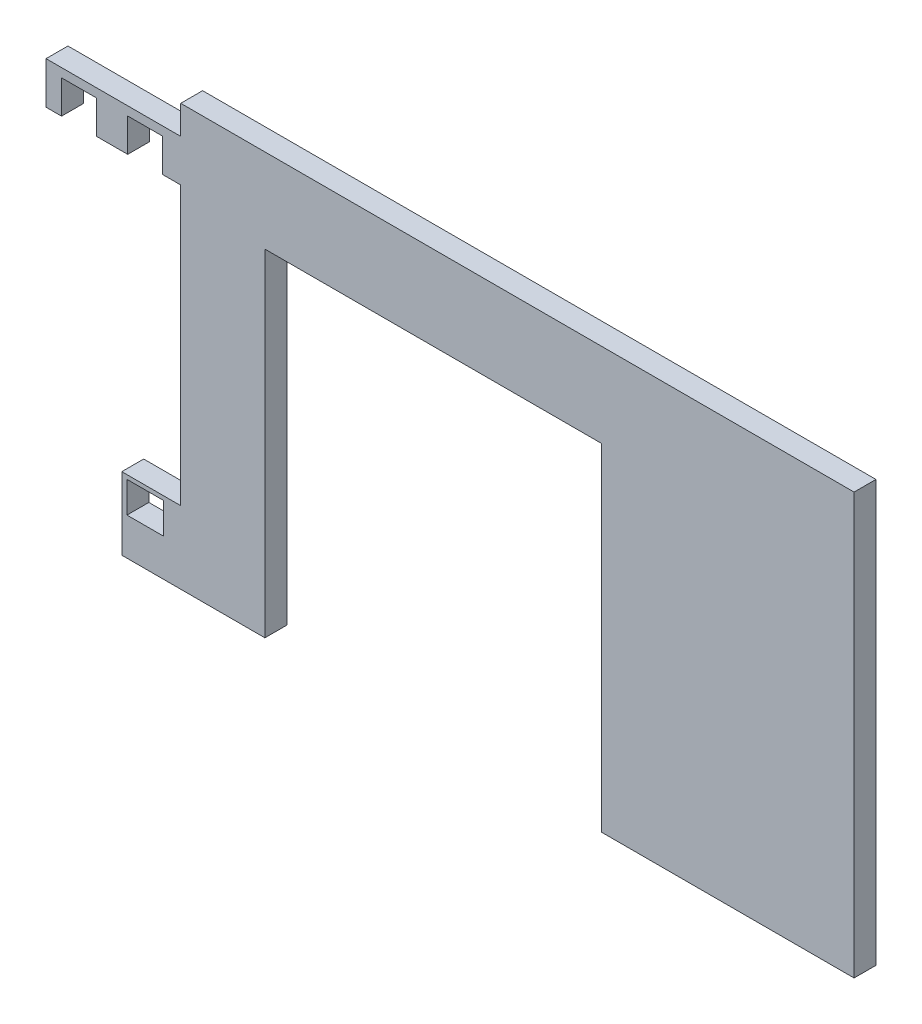
ISO-10303-21;
HEADER;
FILE_DESCRIPTION(('STEP AP214'),'2;1');
FILE_NAME('part.step','',(''),(''),'','','');
FILE_SCHEMA(('AUTOMOTIVE_DESIGN { 1 0 10303 214 1 1 1 1 }'));
ENDSEC;
DATA;
#1=APPLICATION_CONTEXT('core data for automotive mechanical design processes');
#2=APPLICATION_PROTOCOL_DEFINITION('international standard','automotive_design',2000,#1);
#3=PRODUCT_CONTEXT('',#1,'mechanical');
#4=PRODUCT('Part','Part','',(#3));
#5=PRODUCT_RELATED_PRODUCT_CATEGORY('part','',(#4));
#6=PRODUCT_DEFINITION_FORMATION('','',#4);
#7=PRODUCT_DEFINITION_CONTEXT('part definition',#1,'design');
#8=PRODUCT_DEFINITION('design','',#6,#7);
#9=PRODUCT_DEFINITION_SHAPE('','',#8);
#10=(LENGTH_UNIT() NAMED_UNIT(*) SI_UNIT(.MILLI.,.METRE.));
#11=(NAMED_UNIT(*) PLANE_ANGLE_UNIT() SI_UNIT($,.RADIAN.));
#12=(NAMED_UNIT(*) SI_UNIT($,.STERADIAN.) SOLID_ANGLE_UNIT());
#13=UNCERTAINTY_MEASURE_WITH_UNIT(LENGTH_MEASURE(1.E-05),#10,'distance_accuracy_value','');
#14=(GEOMETRIC_REPRESENTATION_CONTEXT(3) GLOBAL_UNCERTAINTY_ASSIGNED_CONTEXT((#13)) GLOBAL_UNIT_ASSIGNED_CONTEXT((#10,
#11,#12)) REPRESENTATION_CONTEXT('',''));
#15=CARTESIAN_POINT('',(0.,0.,0.));
#16=DIRECTION('',(0.,0.,1.));
#17=DIRECTION('',(1.,0.,0.));
#18=AXIS2_PLACEMENT_3D('',#15,#16,#17);
#19=CARTESIAN_POINT('',(-50.8,21.076628061647,21.2890793600851));
#20=DIRECTION('',(0.,-1.,0.));
#21=DIRECTION('',(0.,0.,1.));
#22=AXIS2_PLACEMENT_3D('',#19,#20,#21);
#23=PLANE('',#22);
#24=DIRECTION('',(0.,0.,-1.));
#25=VECTOR('',#24,1.);
#26=CARTESIAN_POINT('',(-68.7837095780898,21.076628061647,0.00100000000000013));
#27=LINE('',#26,#25);
#28=CARTESIAN_POINT('',(-68.7837095780898,21.076628061647,0.));
#29=VERTEX_POINT('',#28);
#30=CARTESIAN_POINT('',(-68.7837095780898,21.076628061647,-3.302));
#31=VERTEX_POINT('',#30);
#32=EDGE_CURVE('E215',#29,#31,#27,.T.);
#33=ORIENTED_EDGE('',*,*,#32,.F.);
#34=DIRECTION('',(-1.,0.,0.));
#35=VECTOR('',#34,1.);
#36=CARTESIAN_POINT('',(-50.8,21.076628061647,0.));
#37=LINE('',#36,#35);
#38=CARTESIAN_POINT('',(-71.12,21.076628061647,0.));
#39=VERTEX_POINT('',#38);
#40=EDGE_CURVE('E224',#29,#39,#37,.T.);
#41=ORIENTED_EDGE('',*,*,#40,.T.);
#42=DIRECTION('',(0.,0.,-1.));
#43=VECTOR('',#42,1.);
#44=CARTESIAN_POINT('',(-71.12,21.076628061647,21.2890793600851));
#45=LINE('',#44,#43);
#46=CARTESIAN_POINT('',(-71.12,21.076628061647,-3.302));
#47=VERTEX_POINT('',#46);
#48=EDGE_CURVE('E345',#39,#47,#45,.T.);
#49=ORIENTED_EDGE('',*,*,#48,.T.);
#50=DIRECTION('',(1.,0.,0.));
#51=VECTOR('',#50,1.);
#52=CARTESIAN_POINT('',(-50.8,21.076628061647,-3.302));
#53=LINE('',#52,#51);
#54=EDGE_CURVE('E237',#47,#31,#53,.T.);
#55=ORIENTED_EDGE('',*,*,#54,.T.);
#56=EDGE_LOOP('',(#33,#41,#49,#55));
#57=FACE_BOUND('',#56,.T.);
#58=ADVANCED_FACE('F35',(#57),#23,.T.);
#59=DIRECTION('',(0.,0.,1.));
#60=VECTOR('',#59,1.);
#61=CARTESIAN_POINT('',(-53.5162904219102,21.076628061647,0.00100000000000013));
#62=LINE('',#61,#60);
#63=CARTESIAN_POINT('',(-53.5162904219102,21.076628061647,-3.302));
#64=VERTEX_POINT('',#63);
#65=CARTESIAN_POINT('',(-53.5162904219102,21.076628061647,0.));
#66=VERTEX_POINT('',#65);
#67=EDGE_CURVE('E260',#64,#66,#62,.T.);
#68=ORIENTED_EDGE('',*,*,#67,.F.);
#69=CARTESIAN_POINT('',(-50.8,21.076628061647,-3.302));
#70=VERTEX_POINT('',#69);
#71=EDGE_CURVE('E339',#64,#70,#53,.T.);
#72=ORIENTED_EDGE('',*,*,#71,.T.);
#73=DIRECTION('',(0.,0.,-1.));
#74=VECTOR('',#73,1.);
#75=CARTESIAN_POINT('',(-50.8,21.076628061647,21.2890793600851));
#76=LINE('',#75,#74);
#77=CARTESIAN_POINT('',(-50.8,21.076628061647,0.));
#78=VERTEX_POINT('',#77);
#79=EDGE_CURVE('E331',#78,#70,#76,.T.);
#80=ORIENTED_EDGE('',*,*,#79,.F.);
#81=EDGE_CURVE('E234',#78,#66,#37,.T.);
#82=ORIENTED_EDGE('',*,*,#81,.T.);
#83=EDGE_LOOP('',(#68,#72,#80,#82));
#84=FACE_BOUND('',#83,.T.);
#85=ADVANCED_FACE('F463',(#84),#23,.T.);
#86=CARTESIAN_POINT('',(-50.8,-31.75,-3.302));
#87=DIRECTION('',(1.,0.,0.));
#88=DIRECTION('',(0.,0.,1.));
#89=AXIS2_PLACEMENT_3D('',#86,#87,#88);
#90=PLANE('',#89);
#91=DIRECTION('',(0.,-1.,0.));
#92=VECTOR('',#91,1.);
#93=CARTESIAN_POINT('',(-50.8,-31.75,0.));
#94=LINE('',#93,#92);
#95=CARTESIAN_POINT('',(-50.8,-20.828,0.));
#96=VERTEX_POINT('',#95);
#97=EDGE_CURVE('E371',#78,#96,#94,.T.);
#98=ORIENTED_EDGE('',*,*,#97,.F.);
#99=ORIENTED_EDGE('',*,*,#79,.T.);
#100=DIRECTION('',(0.,-1.,0.));
#101=VECTOR('',#100,1.);
#102=CARTESIAN_POINT('',(-50.8,-31.75,-3.302));
#103=LINE('',#102,#101);
#104=CARTESIAN_POINT('',(-50.8,-20.828,-3.302));
#105=VERTEX_POINT('',#104);
#106=EDGE_CURVE('E383',#70,#105,#103,.T.);
#107=ORIENTED_EDGE('',*,*,#106,.T.);
#108=DIRECTION('',(0.,0.,-1.));
#109=VECTOR('',#108,1.);
#110=CARTESIAN_POINT('',(-50.8,-20.828,21.2890793600851));
#111=LINE('',#110,#109);
#112=EDGE_CURVE('E322',#96,#105,#111,.T.);
#113=ORIENTED_EDGE('',*,*,#112,.F.);
#114=EDGE_LOOP('',(#98,#99,#107,#113));
#115=FACE_BOUND('',#114,.T.);
#116=ADVANCED_FACE('F469',(#115),#90,.F.);
#117=CARTESIAN_POINT('',(50.8,-31.75,-3.302));
#118=DIRECTION('',(0.,1.,0.));
#119=DIRECTION('',(0.,0.,-1.));
#120=AXIS2_PLACEMENT_3D('',#117,#118,#119);
#121=PLANE('',#120);
#122=DIRECTION('',(1.,0.,0.));
#123=VECTOR('',#122,1.);
#124=CARTESIAN_POINT('',(50.8,-31.75,0.));
#125=LINE('',#124,#123);
#126=CARTESIAN_POINT('',(-59.69,-31.75,0.));
#127=VERTEX_POINT('',#126);
#128=CARTESIAN_POINT('',(-38.1,-31.75,0.));
#129=VERTEX_POINT('',#128);
#130=EDGE_CURVE('E397',#127,#129,#125,.T.);
#131=ORIENTED_EDGE('',*,*,#130,.F.);
#132=DIRECTION('',(0.,0.,-1.));
#133=VECTOR('',#132,1.);
#134=CARTESIAN_POINT('',(-59.69,-31.75,21.2890793600851));
#135=LINE('',#134,#133);
#136=CARTESIAN_POINT('',(-59.69,-31.75,-3.302));
#137=VERTEX_POINT('',#136);
#138=EDGE_CURVE('E317',#127,#137,#135,.T.);
#139=ORIENTED_EDGE('',*,*,#138,.T.);
#140=DIRECTION('',(1.,0.,0.));
#141=VECTOR('',#140,1.);
#142=CARTESIAN_POINT('',(50.8,-31.75,-3.302));
#143=LINE('',#142,#141);
#144=CARTESIAN_POINT('',(-38.1,-31.75,-3.302));
#145=VERTEX_POINT('',#144);
#146=EDGE_CURVE('E384',#137,#145,#143,.T.);
#147=ORIENTED_EDGE('',*,*,#146,.T.);
#148=DIRECTION('',(0.,0.,-1.));
#149=VECTOR('',#148,1.);
#150=CARTESIAN_POINT('',(-38.1,-31.75,0.00100000000000013));
#151=LINE('',#150,#149);
#152=EDGE_CURVE('E368',#129,#145,#151,.T.);
#153=ORIENTED_EDGE('',*,*,#152,.F.);
#154=EDGE_LOOP('',(#131,#139,#147,#153));
#155=FACE_BOUND('',#154,.T.);
#156=ADVANCED_FACE('F480',(#155),#121,.F.);
#157=CARTESIAN_POINT('',(-50.8,31.75,0.));
#158=VERTEX_POINT('',#157);
#159=CARTESIAN_POINT('',(-50.8,27.426628061647,0.));
#160=VERTEX_POINT('',#159);
#161=EDGE_CURVE('E393',#158,#160,#94,.T.);
#162=ORIENTED_EDGE('',*,*,#161,.F.);
#163=DIRECTION('',(0.,0.,1.));
#164=VECTOR('',#163,1.);
#165=CARTESIAN_POINT('',(-50.8,31.75,-3.302));
#166=LINE('',#165,#164);
#167=CARTESIAN_POINT('',(-50.8,31.75,-3.302));
#168=VERTEX_POINT('',#167);
#169=EDGE_CURVE('E392',#168,#158,#166,.T.);
#170=ORIENTED_EDGE('',*,*,#169,.F.);
#171=CARTESIAN_POINT('',(-50.8,27.426628061647,-3.302));
#172=VERTEX_POINT('',#171);
#173=EDGE_CURVE('E379',#168,#172,#103,.T.);
#174=ORIENTED_EDGE('',*,*,#173,.T.);
#175=DIRECTION('',(0.,0.,-1.));
#176=VECTOR('',#175,1.);
#177=CARTESIAN_POINT('',(-50.8,27.426628061647,21.2890793600851));
#178=LINE('',#177,#176);
#179=EDGE_CURVE('E341',#160,#172,#178,.T.);
#180=ORIENTED_EDGE('',*,*,#179,.F.);
#181=EDGE_LOOP('',(#162,#170,#174,#180));
#182=FACE_BOUND('',#181,.T.);
#183=ADVANCED_FACE('F37',(#182),#90,.F.);
#184=CARTESIAN_POINT('',(12.7,-31.75,-3.302));
#185=VERTEX_POINT('',#184);
#186=CARTESIAN_POINT('',(50.8,-31.75,-3.302));
#187=VERTEX_POINT('',#186);
#188=EDGE_CURVE('E382',#185,#187,#143,.T.);
#189=ORIENTED_EDGE('',*,*,#188,.T.);
#190=DIRECTION('',(0.,0.,1.));
#191=VECTOR('',#190,1.);
#192=CARTESIAN_POINT('',(50.8,-31.75,-3.302));
#193=LINE('',#192,#191);
#194=CARTESIAN_POINT('',(50.8,-31.75,0.));
#195=VERTEX_POINT('',#194);
#196=EDGE_CURVE('E11',#187,#195,#193,.T.);
#197=ORIENTED_EDGE('',*,*,#196,.T.);
#198=CARTESIAN_POINT('',(12.7,-31.75,0.));
#199=VERTEX_POINT('',#198);
#200=EDGE_CURVE('E396',#199,#195,#125,.T.);
#201=ORIENTED_EDGE('',*,*,#200,.F.);
#202=DIRECTION('',(0.,0.,-1.));
#203=VECTOR('',#202,1.);
#204=CARTESIAN_POINT('',(12.7,-31.75,0.00100000000000013));
#205=LINE('',#204,#203);
#206=EDGE_CURVE('E374',#199,#185,#205,.T.);
#207=ORIENTED_EDGE('',*,*,#206,.T.);
#208=EDGE_LOOP('',(#189,#197,#201,#207));
#209=FACE_BOUND('',#208,.T.);
#210=ADVANCED_FACE('F418',(#209),#121,.F.);
#211=CARTESIAN_POINT('',(50.8,-31.75,-3.302));
#212=DIRECTION('',(-1.,0.,0.));
#213=DIRECTION('',(0.,0.,-1.));
#214=AXIS2_PLACEMENT_3D('',#211,#212,#213);
#215=PLANE('',#214);
#216=DIRECTION('',(0.,1.,0.));
#217=VECTOR('',#216,1.);
#218=CARTESIAN_POINT('',(50.8,-31.75,0.));
#219=LINE('',#218,#217);
#220=CARTESIAN_POINT('',(50.8,31.75,0.));
#221=VERTEX_POINT('',#220);
#222=EDGE_CURVE('E400',#195,#221,#219,.T.);
#223=ORIENTED_EDGE('',*,*,#222,.F.);
#224=ORIENTED_EDGE('',*,*,#196,.F.);
#225=DIRECTION('',(0.,1.,0.));
#226=VECTOR('',#225,1.);
#227=CARTESIAN_POINT('',(50.8,-31.75,-3.302));
#228=LINE('',#227,#226);
#229=CARTESIAN_POINT('',(50.8,31.75,-3.302));
#230=VERTEX_POINT('',#229);
#231=EDGE_CURVE('E387',#187,#230,#228,.T.);
#232=ORIENTED_EDGE('',*,*,#231,.T.);
#233=DIRECTION('',(0.,0.,1.));
#234=VECTOR('',#233,1.);
#235=CARTESIAN_POINT('',(50.8,31.75,-3.302));
#236=LINE('',#235,#234);
#237=EDGE_CURVE('E43',#230,#221,#236,.T.);
#238=ORIENTED_EDGE('',*,*,#237,.T.);
#239=EDGE_LOOP('',(#223,#224,#232,#238));
#240=FACE_BOUND('',#239,.T.);
#241=ADVANCED_FACE('F409',(#240),#215,.F.);
#242=CARTESIAN_POINT('',(50.8,31.75,-3.302));
#243=DIRECTION('',(0.,-1.,0.));
#244=DIRECTION('',(0.,0.,1.));
#245=AXIS2_PLACEMENT_3D('',#242,#243,#244);
#246=PLANE('',#245);
#247=DIRECTION('',(-1.,0.,0.));
#248=VECTOR('',#247,1.);
#249=CARTESIAN_POINT('',(50.8,31.75,0.));
#250=LINE('',#249,#248);
#251=EDGE_CURVE('E403',#221,#158,#250,.T.);
#252=ORIENTED_EDGE('',*,*,#251,.F.);
#253=ORIENTED_EDGE('',*,*,#237,.F.);
#254=DIRECTION('',(-1.,0.,0.));
#255=VECTOR('',#254,1.);
#256=CARTESIAN_POINT('',(50.8,31.75,-3.302));
#257=LINE('',#256,#255);
#258=EDGE_CURVE('E390',#230,#168,#257,.T.);
#259=ORIENTED_EDGE('',*,*,#258,.T.);
#260=ORIENTED_EDGE('',*,*,#169,.T.);
#261=EDGE_LOOP('',(#252,#253,#259,#260));
#262=FACE_BOUND('',#261,.T.);
#263=ADVANCED_FACE('F425',(#262),#246,.F.);
#264=CARTESIAN_POINT('',(0.,0.,-3.302));
#265=DIRECTION('',(0.,0.,-1.));
#266=DIRECTION('',(1.,0.,0.));
#267=AXIS2_PLACEMENT_3D('',#264,#265,#266);
#268=PLANE('',#267);
#269=DIRECTION('',(0.,-1.,0.));
#270=VECTOR('',#269,1.);
#271=CARTESIAN_POINT('',(-68.7837095780898,26.0929863981767,-3.302));
#272=LINE('',#271,#270);
#273=CARTESIAN_POINT('',(-68.7837095780898,26.0929863981767,-3.302));
#274=VERTEX_POINT('',#273);
#275=EDGE_CURVE('E220',#274,#31,#272,.T.);
#276=ORIENTED_EDGE('',*,*,#275,.T.);
#277=ORIENTED_EDGE('',*,*,#54,.F.);
#278=DIRECTION('',(0.,-1.,0.));
#279=VECTOR('',#278,1.);
#280=CARTESIAN_POINT('',(-71.12,21.076628061647,-3.302));
#281=LINE('',#280,#279);
#282=CARTESIAN_POINT('',(-71.12,27.426628061647,-3.302));
#283=VERTEX_POINT('',#282);
#284=EDGE_CURVE('E337',#283,#47,#281,.T.);
#285=ORIENTED_EDGE('',*,*,#284,.F.);
#286=DIRECTION('',(-1.,0.,0.));
#287=VECTOR('',#286,1.);
#288=CARTESIAN_POINT('',(-50.8,27.426628061647,-3.302));
#289=LINE('',#288,#287);
#290=EDGE_CURVE('E330',#172,#283,#289,.T.);
#291=ORIENTED_EDGE('',*,*,#290,.F.);
#292=ORIENTED_EDGE('',*,*,#173,.F.);
#293=ORIENTED_EDGE('',*,*,#258,.F.);
#294=ORIENTED_EDGE('',*,*,#231,.F.);
#295=ORIENTED_EDGE('',*,*,#188,.F.);
#296=DIRECTION('',(0.,1.,0.));
#297=VECTOR('',#296,1.);
#298=CARTESIAN_POINT('',(12.7,-31.75,-3.302));
#299=LINE('',#298,#297);
#300=CARTESIAN_POINT('',(12.7,19.05,-3.302));
#301=VERTEX_POINT('',#300);
#302=EDGE_CURVE('E362',#185,#301,#299,.T.);
#303=ORIENTED_EDGE('',*,*,#302,.T.);
#304=DIRECTION('',(-1.,0.,0.));
#305=VECTOR('',#304,1.);
#306=CARTESIAN_POINT('',(-38.1,19.05,-3.302));
#307=LINE('',#306,#305);
#308=CARTESIAN_POINT('',(-38.1,19.05,-3.302));
#309=VERTEX_POINT('',#308);
#310=EDGE_CURVE('E365',#301,#309,#307,.T.);
#311=ORIENTED_EDGE('',*,*,#310,.T.);
#312=DIRECTION('',(0.,-1.,0.));
#313=VECTOR('',#312,1.);
#314=CARTESIAN_POINT('',(-38.1,-31.75,-3.302));
#315=LINE('',#314,#313);
#316=EDGE_CURVE('E360',#309,#145,#315,.T.);
#317=ORIENTED_EDGE('',*,*,#316,.T.);
#318=ORIENTED_EDGE('',*,*,#146,.F.);
#319=DIRECTION('',(0.,-1.,0.));
#320=VECTOR('',#319,1.);
#321=CARTESIAN_POINT('',(-59.69,-31.75,-3.302));
#322=LINE('',#321,#320);
#323=CARTESIAN_POINT('',(-59.69,-20.828,-3.302));
#324=VERTEX_POINT('',#323);
#325=EDGE_CURVE('E320',#324,#137,#322,.T.);
#326=ORIENTED_EDGE('',*,*,#325,.F.);
#327=DIRECTION('',(-1.,0.,0.));
#328=VECTOR('',#327,1.);
#329=CARTESIAN_POINT('',(-50.8,-20.828,-3.302));
#330=LINE('',#329,#328);
#331=EDGE_CURVE('E257',#105,#324,#330,.T.);
#332=ORIENTED_EDGE('',*,*,#331,.F.);
#333=ORIENTED_EDGE('',*,*,#106,.F.);
#334=ORIENTED_EDGE('',*,*,#71,.F.);
#335=DIRECTION('',(0.,1.,0.));
#336=VECTOR('',#335,1.);
#337=CARTESIAN_POINT('',(-53.5162904219102,26.0929863981767,-3.302));
#338=LINE('',#337,#336);
#339=CARTESIAN_POINT('',(-53.5162904219102,26.0929863981767,-3.302));
#340=VERTEX_POINT('',#339);
#341=EDGE_CURVE('E275',#64,#340,#338,.T.);
#342=ORIENTED_EDGE('',*,*,#341,.T.);
#343=DIRECTION('',(-1.,0.,0.));
#344=VECTOR('',#343,1.);
#345=CARTESIAN_POINT('',(-53.5162904219102,26.0929863981767,-3.302));
#346=LINE('',#345,#344);
#347=CARTESIAN_POINT('',(-58.8011335400044,26.0929863981767,-3.302));
#348=VERTEX_POINT('',#347);
#349=EDGE_CURVE('E269',#340,#348,#346,.T.);
#350=ORIENTED_EDGE('',*,*,#349,.T.);
#351=DIRECTION('',(0.,-1.,0.));
#352=VECTOR('',#351,1.);
#353=CARTESIAN_POINT('',(-58.8011335400044,26.0929863981767,-3.302));
#354=LINE('',#353,#352);
#355=CARTESIAN_POINT('',(-58.8011335400044,21.076628061647,-3.302));
#356=VERTEX_POINT('',#355);
#357=EDGE_CURVE('E272',#348,#356,#354,.T.);
#358=ORIENTED_EDGE('',*,*,#357,.T.);
#359=CARTESIAN_POINT('',(-63.4988664599956,21.076628061647,-3.302));
#360=VERTEX_POINT('',#359);
#361=EDGE_CURVE('E342',#360,#356,#53,.T.);
#362=ORIENTED_EDGE('',*,*,#361,.F.);
#363=DIRECTION('',(0.,1.,0.));
#364=VECTOR('',#363,1.);
#365=CARTESIAN_POINT('',(-63.4988664599956,26.0929863981767,-3.302));
#366=LINE('',#365,#364);
#367=CARTESIAN_POINT('',(-63.4988664599956,26.0929863981767,-3.302));
#368=VERTEX_POINT('',#367);
#369=EDGE_CURVE('E245',#360,#368,#366,.T.);
#370=ORIENTED_EDGE('',*,*,#369,.T.);
#371=DIRECTION('',(-1.,0.,0.));
#372=VECTOR('',#371,1.);
#373=CARTESIAN_POINT('',(-68.7837095780898,26.0929863981767,-3.302));
#374=LINE('',#373,#372);
#375=EDGE_CURVE('E248',#368,#274,#374,.T.);
#376=ORIENTED_EDGE('',*,*,#375,.T.);
#377=EDGE_LOOP('',(#276,#277,#285,#291,#292,#293,#294,#295,#303,#311,#317,#318,#326,#332,#333,
#334,#342,#350,#358,#362,#370,#376));
#378=FACE_BOUND('',#377,.T.);
#379=DIRECTION('',(0.,-1.,0.));
#380=VECTOR('',#379,1.);
#381=CARTESIAN_POINT('',(-58.9105914384986,-21.444804226857,-3.302));
#382=LINE('',#381,#380);
#383=CARTESIAN_POINT('',(-58.9105914384986,-21.444804226857,-3.302));
#384=VERTEX_POINT('',#383);
#385=CARTESIAN_POINT('',(-58.9105914384986,-26.1131993870927,-3.302));
#386=VERTEX_POINT('',#385);
#387=EDGE_CURVE('E293',#384,#386,#382,.T.);
#388=ORIENTED_EDGE('',*,*,#387,.T.);
#389=DIRECTION('',(1.,0.,0.));
#390=VECTOR('',#389,1.);
#391=CARTESIAN_POINT('',(-58.9105914384986,-26.1131993870927,-3.302));
#392=LINE('',#391,#390);
#393=CARTESIAN_POINT('',(-53.3876390819089,-26.1131993870927,-3.302));
#394=VERTEX_POINT('',#393);
#395=EDGE_CURVE('E296',#386,#394,#392,.T.);
#396=ORIENTED_EDGE('',*,*,#395,.T.);
#397=DIRECTION('',(0.,1.,0.));
#398=VECTOR('',#397,1.);
#399=CARTESIAN_POINT('',(-53.3876390819089,-21.444804226857,-3.302));
#400=LINE('',#399,#398);
#401=CARTESIAN_POINT('',(-53.3876390819089,-21.444804226857,-3.302));
#402=VERTEX_POINT('',#401);
#403=EDGE_CURVE('E299',#394,#402,#400,.T.);
#404=ORIENTED_EDGE('',*,*,#403,.T.);
#405=DIRECTION('',(-1.,0.,0.));
#406=VECTOR('',#405,1.);
#407=CARTESIAN_POINT('',(-58.9105914384986,-21.444804226857,-3.302));
#408=LINE('',#407,#406);
#409=EDGE_CURVE('E302',#402,#384,#408,.T.);
#410=ORIENTED_EDGE('',*,*,#409,.T.);
#411=EDGE_LOOP('',(#388,#396,#404,#410));
#412=FACE_BOUND('',#411,.T.);
#413=ADVANCED_FACE('F421',(#378,#412),#268,.T.);
#414=CARTESIAN_POINT('',(0.,0.,0.));
#415=DIRECTION('',(0.,0.,-1.));
#416=DIRECTION('',(1.,0.,0.));
#417=AXIS2_PLACEMENT_3D('',#414,#415,#416);
#418=PLANE('',#417);
#419=DIRECTION('',(1.,0.,0.));
#420=VECTOR('',#419,1.);
#421=CARTESIAN_POINT('',(-58.9105914384986,-21.444804226857,0.));
#422=LINE('',#421,#420);
#423=CARTESIAN_POINT('',(-58.9105914384986,-21.444804226857,0.));
#424=VERTEX_POINT('',#423);
#425=CARTESIAN_POINT('',(-53.3876390819089,-21.444804226857,0.));
#426=VERTEX_POINT('',#425);
#427=EDGE_CURVE('E287',#424,#426,#422,.T.);
#428=ORIENTED_EDGE('',*,*,#427,.T.);
#429=DIRECTION('',(0.,-1.,0.));
#430=VECTOR('',#429,1.);
#431=CARTESIAN_POINT('',(-53.3876390819089,-21.444804226857,0.));
#432=LINE('',#431,#430);
#433=CARTESIAN_POINT('',(-53.3876390819089,-26.1131993870927,0.));
#434=VERTEX_POINT('',#433);
#435=EDGE_CURVE('E284',#426,#434,#432,.T.);
#436=ORIENTED_EDGE('',*,*,#435,.T.);
#437=DIRECTION('',(-1.,0.,0.));
#438=VECTOR('',#437,1.);
#439=CARTESIAN_POINT('',(-58.9105914384986,-26.1131993870927,0.));
#440=LINE('',#439,#438);
#441=CARTESIAN_POINT('',(-58.9105914384986,-26.1131993870927,0.));
#442=VERTEX_POINT('',#441);
#443=EDGE_CURVE('E261',#434,#442,#440,.T.);
#444=ORIENTED_EDGE('',*,*,#443,.T.);
#445=DIRECTION('',(0.,1.,0.));
#446=VECTOR('',#445,1.);
#447=CARTESIAN_POINT('',(-58.9105914384986,-21.444804226857,0.));
#448=LINE('',#447,#446);
#449=EDGE_CURVE('E290',#442,#424,#448,.T.);
#450=ORIENTED_EDGE('',*,*,#449,.T.);
#451=EDGE_LOOP('',(#428,#436,#444,#450));
#452=FACE_BOUND('',#451,.T.);
#453=DIRECTION('',(1.,0.,0.));
#454=VECTOR('',#453,1.);
#455=CARTESIAN_POINT('',(-68.7837095780898,26.0929863981767,0.));
#456=LINE('',#455,#454);
#457=CARTESIAN_POINT('',(-68.7837095780898,26.0929863981767,0.));
#458=VERTEX_POINT('',#457);
#459=CARTESIAN_POINT('',(-63.4988664599956,26.0929863981767,0.));
#460=VERTEX_POINT('',#459);
#461=EDGE_CURVE('E221',#458,#460,#456,.T.);
#462=ORIENTED_EDGE('',*,*,#461,.T.);
#463=DIRECTION('',(0.,-1.,0.));
#464=VECTOR('',#463,1.);
#465=CARTESIAN_POINT('',(-63.4988664599956,26.0929863981767,0.));
#466=LINE('',#465,#464);
#467=CARTESIAN_POINT('',(-63.4988664599956,21.076628061647,0.));
#468=VERTEX_POINT('',#467);
#469=EDGE_CURVE('E253',#460,#468,#466,.T.);
#470=ORIENTED_EDGE('',*,*,#469,.T.);
#471=CARTESIAN_POINT('',(-58.8011335400044,21.076628061647,0.));
#472=VERTEX_POINT('',#471);
#473=EDGE_CURVE('E232',#472,#468,#37,.T.);
#474=ORIENTED_EDGE('',*,*,#473,.F.);
#475=DIRECTION('',(0.,1.,0.));
#476=VECTOR('',#475,1.);
#477=CARTESIAN_POINT('',(-58.8011335400044,26.0929863981767,0.));
#478=LINE('',#477,#476);
#479=CARTESIAN_POINT('',(-58.8011335400044,26.0929863981767,0.));
#480=VERTEX_POINT('',#479);
#481=EDGE_CURVE('E241',#472,#480,#478,.T.);
#482=ORIENTED_EDGE('',*,*,#481,.T.);
#483=DIRECTION('',(1.,0.,0.));
#484=VECTOR('',#483,1.);
#485=CARTESIAN_POINT('',(-53.5162904219102,26.0929863981767,0.));
#486=LINE('',#485,#484);
#487=CARTESIAN_POINT('',(-53.5162904219102,26.0929863981767,0.));
#488=VERTEX_POINT('',#487);
#489=EDGE_CURVE('E264',#480,#488,#486,.T.);
#490=ORIENTED_EDGE('',*,*,#489,.T.);
#491=DIRECTION('',(0.,-1.,0.));
#492=VECTOR('',#491,1.);
#493=CARTESIAN_POINT('',(-53.5162904219102,26.0929863981767,0.));
#494=LINE('',#493,#492);
#495=EDGE_CURVE('E267',#488,#66,#494,.T.);
#496=ORIENTED_EDGE('',*,*,#495,.T.);
#497=ORIENTED_EDGE('',*,*,#81,.F.);
#498=ORIENTED_EDGE('',*,*,#97,.T.);
#499=DIRECTION('',(1.,0.,0.));
#500=VECTOR('',#499,1.);
#501=CARTESIAN_POINT('',(-50.8,-20.828,0.));
#502=LINE('',#501,#500);
#503=CARTESIAN_POINT('',(-59.69,-20.828,0.));
#504=VERTEX_POINT('',#503);
#505=EDGE_CURVE('E316',#504,#96,#502,.T.);
#506=ORIENTED_EDGE('',*,*,#505,.F.);
#507=DIRECTION('',(0.,1.,0.));
#508=VECTOR('',#507,1.);
#509=CARTESIAN_POINT('',(-59.69,-31.75,0.));
#510=LINE('',#509,#508);
#511=EDGE_CURVE('E313',#127,#504,#510,.T.);
#512=ORIENTED_EDGE('',*,*,#511,.F.);
#513=ORIENTED_EDGE('',*,*,#130,.T.);
#514=DIRECTION('',(0.,1.,0.));
#515=VECTOR('',#514,1.);
#516=CARTESIAN_POINT('',(-38.1,-31.75,0.));
#517=LINE('',#516,#515);
#518=CARTESIAN_POINT('',(-38.1,19.05,0.));
#519=VERTEX_POINT('',#518);
#520=EDGE_CURVE('E357',#129,#519,#517,.T.);
#521=ORIENTED_EDGE('',*,*,#520,.T.);
#522=DIRECTION('',(1.,0.,0.));
#523=VECTOR('',#522,1.);
#524=CARTESIAN_POINT('',(-38.1,19.05,0.));
#525=LINE('',#524,#523);
#526=CARTESIAN_POINT('',(12.7,19.05,0.));
#527=VERTEX_POINT('',#526);
#528=EDGE_CURVE('E354',#519,#527,#525,.T.);
#529=ORIENTED_EDGE('',*,*,#528,.T.);
#530=DIRECTION('',(0.,-1.,0.));
#531=VECTOR('',#530,1.);
#532=CARTESIAN_POINT('',(12.7,-31.75,0.));
#533=LINE('',#532,#531);
#534=EDGE_CURVE('E352',#527,#199,#533,.T.);
#535=ORIENTED_EDGE('',*,*,#534,.T.);
#536=ORIENTED_EDGE('',*,*,#200,.T.);
#537=ORIENTED_EDGE('',*,*,#222,.T.);
#538=ORIENTED_EDGE('',*,*,#251,.T.);
#539=ORIENTED_EDGE('',*,*,#161,.T.);
#540=DIRECTION('',(1.,0.,0.));
#541=VECTOR('',#540,1.);
#542=CARTESIAN_POINT('',(-50.8,27.426628061647,0.));
#543=LINE('',#542,#541);
#544=CARTESIAN_POINT('',(-71.12,27.426628061647,0.));
#545=VERTEX_POINT('',#544);
#546=EDGE_CURVE('E334',#545,#160,#543,.T.);
#547=ORIENTED_EDGE('',*,*,#546,.F.);
#548=DIRECTION('',(0.,1.,0.));
#549=VECTOR('',#548,1.);
#550=CARTESIAN_POINT('',(-71.12,21.076628061647,0.));
#551=LINE('',#550,#549);
#552=EDGE_CURVE('E228',#39,#545,#551,.T.);
#553=ORIENTED_EDGE('',*,*,#552,.F.);
#554=ORIENTED_EDGE('',*,*,#40,.F.);
#555=DIRECTION('',(0.,1.,0.));
#556=VECTOR('',#555,1.);
#557=CARTESIAN_POINT('',(-68.7837095780898,26.0929863981767,0.));
#558=LINE('',#557,#556);
#559=EDGE_CURVE('E210',#29,#458,#558,.T.);
#560=ORIENTED_EDGE('',*,*,#559,.T.);
#561=EDGE_LOOP('',(#462,#470,#474,#482,#490,#496,#497,#498,#506,#512,#513,#521,#529,#535,#536,
#537,#538,#539,#547,#553,#554,#560));
#562=FACE_BOUND('',#561,.T.);
#563=ADVANCED_FACE('F225',(#452,#562),#418,.F.);
#564=CARTESIAN_POINT('',(-38.1,-31.75,0.00100000000000013));
#565=DIRECTION('',(-1.,0.,0.));
#566=DIRECTION('',(0.,0.,-1.));
#567=AXIS2_PLACEMENT_3D('',#564,#565,#566);
#568=PLANE('',#567);
#569=ORIENTED_EDGE('',*,*,#520,.F.);
#570=ORIENTED_EDGE('',*,*,#152,.T.);
#571=ORIENTED_EDGE('',*,*,#316,.F.);
#572=DIRECTION('',(0.,0.,-1.));
#573=VECTOR('',#572,1.);
#574=CARTESIAN_POINT('',(-38.1,19.05,0.00100000000000013));
#575=LINE('',#574,#573);
#576=EDGE_CURVE('E369',#519,#309,#575,.T.);
#577=ORIENTED_EDGE('',*,*,#576,.F.);
#578=EDGE_LOOP('',(#569,#570,#571,#577));
#579=FACE_BOUND('',#578,.T.);
#580=ADVANCED_FACE('F484',(#579),#568,.F.);
#581=CARTESIAN_POINT('',(-38.1,19.05,0.00100000000000013));
#582=DIRECTION('',(0.,1.,0.));
#583=DIRECTION('',(0.,0.,-1.));
#584=AXIS2_PLACEMENT_3D('',#581,#582,#583);
#585=PLANE('',#584);
#586=ORIENTED_EDGE('',*,*,#528,.F.);
#587=ORIENTED_EDGE('',*,*,#576,.T.);
#588=ORIENTED_EDGE('',*,*,#310,.F.);
#589=DIRECTION('',(0.,0.,-1.));
#590=VECTOR('',#589,1.);
#591=CARTESIAN_POINT('',(12.7,19.05,0.00100000000000013));
#592=LINE('',#591,#590);
#593=EDGE_CURVE('E372',#527,#301,#592,.T.);
#594=ORIENTED_EDGE('',*,*,#593,.F.);
#595=EDGE_LOOP('',(#586,#587,#588,#594));
#596=FACE_BOUND('',#595,.T.);
#597=ADVANCED_FACE('F488',(#596),#585,.F.);
#598=CARTESIAN_POINT('',(12.7,-31.75,0.00100000000000013));
#599=DIRECTION('',(1.,0.,0.));
#600=DIRECTION('',(0.,0.,1.));
#601=AXIS2_PLACEMENT_3D('',#598,#599,#600);
#602=PLANE('',#601);
#603=ORIENTED_EDGE('',*,*,#534,.F.);
#604=ORIENTED_EDGE('',*,*,#593,.T.);
#605=ORIENTED_EDGE('',*,*,#302,.F.);
#606=ORIENTED_EDGE('',*,*,#206,.F.);
#607=EDGE_LOOP('',(#603,#604,#605,#606));
#608=FACE_BOUND('',#607,.T.);
#609=ADVANCED_FACE('F490',(#608),#602,.F.);
#610=DIRECTION('',(0.,0.,1.));
#611=VECTOR('',#610,1.);
#612=CARTESIAN_POINT('',(-63.4988664599956,21.076628061647,0.00100000000000013));
#613=LINE('',#612,#611);
#614=EDGE_CURVE('E238',#360,#468,#613,.T.);
#615=ORIENTED_EDGE('',*,*,#614,.F.);
#616=ORIENTED_EDGE('',*,*,#361,.T.);
#617=DIRECTION('',(0.,0.,-1.));
#618=VECTOR('',#617,1.);
#619=CARTESIAN_POINT('',(-58.8011335400044,21.076628061647,0.00100000000000013));
#620=LINE('',#619,#618);
#621=EDGE_CURVE('E258',#472,#356,#620,.T.);
#622=ORIENTED_EDGE('',*,*,#621,.F.);
#623=ORIENTED_EDGE('',*,*,#473,.T.);
#624=EDGE_LOOP('',(#615,#616,#622,#623));
#625=FACE_BOUND('',#624,.T.);
#626=ADVANCED_FACE('F446',(#625),#23,.T.);
#627=CARTESIAN_POINT('',(-71.12,21.076628061647,21.2890793600851));
#628=DIRECTION('',(-1.,0.,0.));
#629=DIRECTION('',(0.,0.,-1.));
#630=AXIS2_PLACEMENT_3D('',#627,#628,#629);
#631=PLANE('',#630);
#632=ORIENTED_EDGE('',*,*,#552,.T.);
#633=DIRECTION('',(0.,0.,-1.));
#634=VECTOR('',#633,1.);
#635=CARTESIAN_POINT('',(-71.12,27.426628061647,21.2890793600851));
#636=LINE('',#635,#634);
#637=EDGE_CURVE('E347',#545,#283,#636,.T.);
#638=ORIENTED_EDGE('',*,*,#637,.T.);
#639=ORIENTED_EDGE('',*,*,#284,.T.);
#640=ORIENTED_EDGE('',*,*,#48,.F.);
#641=EDGE_LOOP('',(#632,#638,#639,#640));
#642=FACE_BOUND('',#641,.T.);
#643=ADVANCED_FACE('F433',(#642),#631,.T.);
#644=CARTESIAN_POINT('',(-50.8,27.426628061647,21.2890793600851));
#645=DIRECTION('',(0.,1.,0.));
#646=DIRECTION('',(-1.,0.,0.));
#647=AXIS2_PLACEMENT_3D('',#644,#645,#646);
#648=PLANE('',#647);
#649=ORIENTED_EDGE('',*,*,#546,.T.);
#650=ORIENTED_EDGE('',*,*,#179,.T.);
#651=ORIENTED_EDGE('',*,*,#290,.T.);
#652=ORIENTED_EDGE('',*,*,#637,.F.);
#653=EDGE_LOOP('',(#649,#650,#651,#652));
#654=FACE_BOUND('',#653,.T.);
#655=ADVANCED_FACE('F430',(#654),#648,.T.);
#656=CARTESIAN_POINT('',(-59.69,-31.75,21.2890793600851));
#657=DIRECTION('',(-1.,0.,0.));
#658=DIRECTION('',(0.,-1.,0.));
#659=AXIS2_PLACEMENT_3D('',#656,#657,#658);
#660=PLANE('',#659);
#661=ORIENTED_EDGE('',*,*,#511,.T.);
#662=DIRECTION('',(0.,0.,-1.));
#663=VECTOR('',#662,1.);
#664=CARTESIAN_POINT('',(-59.69,-20.828,21.2890793600851));
#665=LINE('',#664,#663);
#666=EDGE_CURVE('E325',#504,#324,#665,.T.);
#667=ORIENTED_EDGE('',*,*,#666,.T.);
#668=ORIENTED_EDGE('',*,*,#325,.T.);
#669=ORIENTED_EDGE('',*,*,#138,.F.);
#670=EDGE_LOOP('',(#661,#667,#668,#669));
#671=FACE_BOUND('',#670,.T.);
#672=ADVANCED_FACE('F476',(#671),#660,.T.);
#673=CARTESIAN_POINT('',(-50.8,-20.828,21.2890793600851));
#674=DIRECTION('',(0.,1.,0.));
#675=DIRECTION('',(0.,0.,-1.));
#676=AXIS2_PLACEMENT_3D('',#673,#674,#675);
#677=PLANE('',#676);
#678=ORIENTED_EDGE('',*,*,#505,.T.);
#679=ORIENTED_EDGE('',*,*,#112,.T.);
#680=ORIENTED_EDGE('',*,*,#331,.T.);
#681=ORIENTED_EDGE('',*,*,#666,.F.);
#682=EDGE_LOOP('',(#678,#679,#680,#681));
#683=FACE_BOUND('',#682,.T.);
#684=ADVANCED_FACE('F472',(#683),#677,.T.);
#685=CARTESIAN_POINT('',(-53.5162904219102,26.0929863981767,0.00100000000000013));
#686=DIRECTION('',(0.,1.,0.));
#687=DIRECTION('',(0.,0.,-1.));
#688=AXIS2_PLACEMENT_3D('',#685,#686,#687);
#689=PLANE('',#688);
#690=ORIENTED_EDGE('',*,*,#489,.F.);
#691=DIRECTION('',(0.,0.,-1.));
#692=VECTOR('',#691,1.);
#693=CARTESIAN_POINT('',(-58.8011335400044,26.0929863981767,0.00100000000000013));
#694=LINE('',#693,#692);
#695=EDGE_CURVE('E278',#480,#348,#694,.T.);
#696=ORIENTED_EDGE('',*,*,#695,.T.);
#697=ORIENTED_EDGE('',*,*,#349,.F.);
#698=DIRECTION('',(0.,0.,-1.));
#699=VECTOR('',#698,1.);
#700=CARTESIAN_POINT('',(-53.5162904219102,26.0929863981767,0.00100000000000013));
#701=LINE('',#700,#699);
#702=EDGE_CURVE('E279',#488,#340,#701,.T.);
#703=ORIENTED_EDGE('',*,*,#702,.F.);
#704=EDGE_LOOP('',(#690,#696,#697,#703));
#705=FACE_BOUND('',#704,.T.);
#706=ADVANCED_FACE('F455',(#705),#689,.F.);
#707=CARTESIAN_POINT('',(-53.5162904219102,26.0929863981767,0.00100000000000013));
#708=DIRECTION('',(1.,0.,0.));
#709=DIRECTION('',(0.,0.,1.));
#710=AXIS2_PLACEMENT_3D('',#707,#708,#709);
#711=PLANE('',#710);
#712=ORIENTED_EDGE('',*,*,#495,.F.);
#713=ORIENTED_EDGE('',*,*,#702,.T.);
#714=ORIENTED_EDGE('',*,*,#341,.F.);
#715=ORIENTED_EDGE('',*,*,#67,.T.);
#716=EDGE_LOOP('',(#712,#713,#714,#715));
#717=FACE_BOUND('',#716,.T.);
#718=ADVANCED_FACE('F458',(#717),#711,.F.);
#719=CARTESIAN_POINT('',(-58.8011335400044,26.0929863981767,0.00100000000000013));
#720=DIRECTION('',(-1.,0.,0.));
#721=DIRECTION('',(0.,0.,-1.));
#722=AXIS2_PLACEMENT_3D('',#719,#720,#721);
#723=PLANE('',#722);
#724=ORIENTED_EDGE('',*,*,#481,.F.);
#725=ORIENTED_EDGE('',*,*,#621,.T.);
#726=ORIENTED_EDGE('',*,*,#357,.F.);
#727=ORIENTED_EDGE('',*,*,#695,.F.);
#728=EDGE_LOOP('',(#724,#725,#726,#727));
#729=FACE_BOUND('',#728,.T.);
#730=ADVANCED_FACE('F450',(#729),#723,.F.);
#731=CARTESIAN_POINT('',(-68.7837095780898,26.0929863981767,0.00100000000000013));
#732=DIRECTION('',(-1.,0.,0.));
#733=DIRECTION('',(0.,0.,-1.));
#734=AXIS2_PLACEMENT_3D('',#731,#732,#733);
#735=PLANE('',#734);
#736=ORIENTED_EDGE('',*,*,#559,.F.);
#737=ORIENTED_EDGE('',*,*,#32,.T.);
#738=ORIENTED_EDGE('',*,*,#275,.F.);
#739=DIRECTION('',(0.,0.,-1.));
#740=VECTOR('',#739,1.);
#741=CARTESIAN_POINT('',(-68.7837095780898,26.0929863981767,0.00100000000000013));
#742=LINE('',#741,#740);
#743=EDGE_CURVE('E216',#458,#274,#742,.T.);
#744=ORIENTED_EDGE('',*,*,#743,.F.);
#745=EDGE_LOOP('',(#736,#737,#738,#744));
#746=FACE_BOUND('',#745,.T.);
#747=ADVANCED_FACE('F212',(#746),#735,.F.);
#748=CARTESIAN_POINT('',(-68.7837095780898,26.0929863981767,0.00100000000000013));
#749=DIRECTION('',(0.,1.,0.));
#750=DIRECTION('',(0.,0.,-1.));
#751=AXIS2_PLACEMENT_3D('',#748,#749,#750);
#752=PLANE('',#751);
#753=ORIENTED_EDGE('',*,*,#461,.F.);
#754=ORIENTED_EDGE('',*,*,#743,.T.);
#755=ORIENTED_EDGE('',*,*,#375,.F.);
#756=DIRECTION('',(0.,0.,-1.));
#757=VECTOR('',#756,1.);
#758=CARTESIAN_POINT('',(-63.4988664599956,26.0929863981767,0.00100000000000013));
#759=LINE('',#758,#757);
#760=EDGE_CURVE('E251',#460,#368,#759,.T.);
#761=ORIENTED_EDGE('',*,*,#760,.F.);
#762=EDGE_LOOP('',(#753,#754,#755,#761));
#763=FACE_BOUND('',#762,.T.);
#764=ADVANCED_FACE('F438',(#763),#752,.F.);
#765=CARTESIAN_POINT('',(-63.4988664599956,26.0929863981767,0.00100000000000013));
#766=DIRECTION('',(1.,0.,0.));
#767=DIRECTION('',(0.,0.,1.));
#768=AXIS2_PLACEMENT_3D('',#765,#766,#767);
#769=PLANE('',#768);
#770=ORIENTED_EDGE('',*,*,#469,.F.);
#771=ORIENTED_EDGE('',*,*,#760,.T.);
#772=ORIENTED_EDGE('',*,*,#369,.F.);
#773=ORIENTED_EDGE('',*,*,#614,.T.);
#774=EDGE_LOOP('',(#770,#771,#772,#773));
#775=FACE_BOUND('',#774,.T.);
#776=ADVANCED_FACE('F443',(#775),#769,.F.);
#777=CARTESIAN_POINT('',(-58.9105914384986,-21.444804226857,0.00100000000000013));
#778=DIRECTION('',(-1.,0.,0.));
#779=DIRECTION('',(0.,0.,-1.));
#780=AXIS2_PLACEMENT_3D('',#777,#778,#779);
#781=PLANE('',#780);
#782=ORIENTED_EDGE('',*,*,#449,.F.);
#783=DIRECTION('',(0.,0.,-1.));
#784=VECTOR('',#783,1.);
#785=CARTESIAN_POINT('',(-58.9105914384986,-26.1131993870927,0.00100000000000013));
#786=LINE('',#785,#784);
#787=EDGE_CURVE('E50',#442,#386,#786,.T.);
#788=ORIENTED_EDGE('',*,*,#787,.T.);
#789=ORIENTED_EDGE('',*,*,#387,.F.);
#790=DIRECTION('',(0.,0.,-1.));
#791=VECTOR('',#790,1.);
#792=CARTESIAN_POINT('',(-58.9105914384986,-21.444804226857,0.00100000000000013));
#793=LINE('',#792,#791);
#794=EDGE_CURVE('E305',#424,#384,#793,.T.);
#795=ORIENTED_EDGE('',*,*,#794,.F.);
#796=EDGE_LOOP('',(#782,#788,#789,#795));
#797=FACE_BOUND('',#796,.T.);
#798=ADVANCED_FACE('F517',(#797),#781,.F.);
#799=CARTESIAN_POINT('',(-58.9105914384986,-21.444804226857,0.00100000000000013));
#800=DIRECTION('',(0.,1.,0.));
#801=DIRECTION('',(0.,0.,-1.));
#802=AXIS2_PLACEMENT_3D('',#799,#800,#801);
#803=PLANE('',#802);
#804=ORIENTED_EDGE('',*,*,#427,.F.);
#805=ORIENTED_EDGE('',*,*,#794,.T.);
#806=ORIENTED_EDGE('',*,*,#409,.F.);
#807=DIRECTION('',(0.,0.,-1.));
#808=VECTOR('',#807,1.);
#809=CARTESIAN_POINT('',(-53.3876390819089,-21.444804226857,0.00100000000000013));
#810=LINE('',#809,#808);
#811=EDGE_CURVE('E307',#426,#402,#810,.T.);
#812=ORIENTED_EDGE('',*,*,#811,.F.);
#813=EDGE_LOOP('',(#804,#805,#806,#812));
#814=FACE_BOUND('',#813,.T.);
#815=ADVANCED_FACE('F520',(#814),#803,.F.);
#816=CARTESIAN_POINT('',(-53.3876390819089,-21.444804226857,0.00100000000000013));
#817=DIRECTION('',(1.,0.,0.));
#818=DIRECTION('',(0.,0.,1.));
#819=AXIS2_PLACEMENT_3D('',#816,#817,#818);
#820=PLANE('',#819);
#821=ORIENTED_EDGE('',*,*,#435,.F.);
#822=ORIENTED_EDGE('',*,*,#811,.T.);
#823=ORIENTED_EDGE('',*,*,#403,.F.);
#824=DIRECTION('',(0.,0.,-1.));
#825=VECTOR('',#824,1.);
#826=CARTESIAN_POINT('',(-53.3876390819089,-26.1131993870927,0.00100000000000013));
#827=LINE('',#826,#825);
#828=EDGE_CURVE('E58',#434,#394,#827,.T.);
#829=ORIENTED_EDGE('',*,*,#828,.F.);
#830=EDGE_LOOP('',(#821,#822,#823,#829));
#831=FACE_BOUND('',#830,.T.);
#832=ADVANCED_FACE('F524',(#831),#820,.F.);
#833=CARTESIAN_POINT('',(-58.9105914384986,-26.1131993870927,0.00100000000000013));
#834=DIRECTION('',(0.,-1.,0.));
#835=DIRECTION('',(0.,0.,1.));
#836=AXIS2_PLACEMENT_3D('',#833,#834,#835);
#837=PLANE('',#836);
#838=ORIENTED_EDGE('',*,*,#443,.F.);
#839=ORIENTED_EDGE('',*,*,#828,.T.);
#840=ORIENTED_EDGE('',*,*,#395,.F.);
#841=ORIENTED_EDGE('',*,*,#787,.F.);
#842=EDGE_LOOP('',(#838,#839,#840,#841));
#843=FACE_BOUND('',#842,.T.);
#844=ADVANCED_FACE('F521',(#843),#837,.F.);
#845=CLOSED_SHELL('',(#58,#85,#116,#156,#183,#210,#241,#263,#413,#563,#580,#597,#609,#626,#643,
#655,#672,#684,#706,#718,#730,#747,#764,#776,#798,#815,#832,#844));
#846=MANIFOLD_SOLID_BREP('B2',#845);
#847=ADVANCED_BREP_SHAPE_REPRESENTATION('',(#18,#846),#14);
#848=SHAPE_DEFINITION_REPRESENTATION(#9,#847);
ENDSEC;
END-ISO-10303-21;
